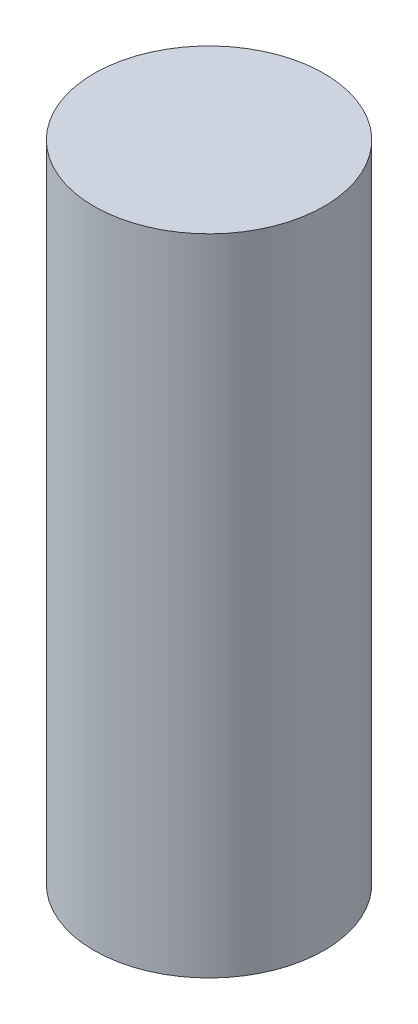
ISO-10303-21;
HEADER;
FILE_DESCRIPTION(('STEP AP214'),'2;1');
FILE_NAME('part.step','',(''),(''),'','','');
FILE_SCHEMA(('AUTOMOTIVE_DESIGN { 1 0 10303 214 1 1 1 1 }'));
ENDSEC;
DATA;
#1=APPLICATION_CONTEXT('core data for automotive mechanical design processes');
#2=APPLICATION_PROTOCOL_DEFINITION('international standard','automotive_design',2000,#1);
#3=PRODUCT_CONTEXT('',#1,'mechanical');
#4=PRODUCT('Part','Part','',(#3));
#5=PRODUCT_RELATED_PRODUCT_CATEGORY('part','',(#4));
#6=PRODUCT_DEFINITION_FORMATION('','',#4);
#7=PRODUCT_DEFINITION_CONTEXT('part definition',#1,'design');
#8=PRODUCT_DEFINITION('design','',#6,#7);
#9=PRODUCT_DEFINITION_SHAPE('','',#8);
#10=(LENGTH_UNIT() NAMED_UNIT(*) SI_UNIT(.MILLI.,.METRE.));
#11=(NAMED_UNIT(*) PLANE_ANGLE_UNIT() SI_UNIT($,.RADIAN.));
#12=(NAMED_UNIT(*) SI_UNIT($,.STERADIAN.) SOLID_ANGLE_UNIT());
#13=UNCERTAINTY_MEASURE_WITH_UNIT(LENGTH_MEASURE(1.E-05),#10,'distance_accuracy_value','');
#14=(GEOMETRIC_REPRESENTATION_CONTEXT(3) GLOBAL_UNCERTAINTY_ASSIGNED_CONTEXT((#13)) GLOBAL_UNIT_ASSIGNED_CONTEXT((#10,
#11,#12)) REPRESENTATION_CONTEXT('',''));
#15=CARTESIAN_POINT('',(0.,0.,0.));
#16=DIRECTION('',(0.,0.,1.));
#17=DIRECTION('',(1.,0.,0.));
#18=AXIS2_PLACEMENT_3D('',#15,#16,#17);
#19=CARTESIAN_POINT('',(0.,14.,0.));
#20=DIRECTION('',(0.,-1.,0.));
#21=DIRECTION('',(0.,0.,-1.));
#22=AXIS2_PLACEMENT_3D('',#19,#20,#21);
#23=CYLINDRICAL_SURFACE('',#22,2.5);
#24=CARTESIAN_POINT('',(0.,14.,0.));
#25=DIRECTION('',(0.,1.,0.));
#26=DIRECTION('',(0.,0.,1.));
#27=AXIS2_PLACEMENT_3D('',#24,#25,#26);
#28=CIRCLE('',#27,2.5);
#29=CARTESIAN_POINT('',(0.,14.,2.5));
#30=VERTEX_POINT('',#29);
#31=EDGE_CURVE('E10',#30,#30,#28,.T.);
#32=ORIENTED_EDGE('',*,*,#31,.F.);
#33=EDGE_LOOP('',(#32));
#34=FACE_BOUND('',#33,.T.);
#35=CARTESIAN_POINT('',(0.,0.,0.));
#36=DIRECTION('',(0.,1.,0.));
#37=DIRECTION('',(0.,0.,1.));
#38=AXIS2_PLACEMENT_3D('',#35,#36,#37);
#39=CIRCLE('',#38,2.5);
#40=CARTESIAN_POINT('',(0.,0.,2.5));
#41=VERTEX_POINT('',#40);
#42=EDGE_CURVE('E33',#41,#41,#39,.T.);
#43=ORIENTED_EDGE('',*,*,#42,.T.);
#44=EDGE_LOOP('',(#43));
#45=FACE_BOUND('',#44,.T.);
#46=ADVANCED_FACE('F30',(#34,#45),#23,.T.);
#47=CARTESIAN_POINT('',(0.,14.,0.));
#48=DIRECTION('',(0.,1.,0.));
#49=DIRECTION('',(0.,0.,1.));
#50=AXIS2_PLACEMENT_3D('',#47,#48,#49);
#51=PLANE('',#50);
#52=ORIENTED_EDGE('',*,*,#31,.T.);
#53=EDGE_LOOP('',(#52));
#54=FACE_BOUND('',#53,.T.);
#55=ADVANCED_FACE('F45',(#54),#51,.T.);
#56=CARTESIAN_POINT('',(0.,0.,0.));
#57=DIRECTION('',(0.,1.,0.));
#58=DIRECTION('',(0.,0.,1.));
#59=AXIS2_PLACEMENT_3D('',#56,#57,#58);
#60=PLANE('',#59);
#61=ORIENTED_EDGE('',*,*,#42,.F.);
#62=EDGE_LOOP('',(#61));
#63=FACE_BOUND('',#62,.T.);
#64=ADVANCED_FACE('F43',(#63),#60,.F.);
#65=CLOSED_SHELL('',(#46,#55,#64));
#66=MANIFOLD_SOLID_BREP('B2',#65);
#67=ADVANCED_BREP_SHAPE_REPRESENTATION('',(#18,#66),#14);
#68=SHAPE_DEFINITION_REPRESENTATION(#9,#67);
ENDSEC;
END-ISO-10303-21;
